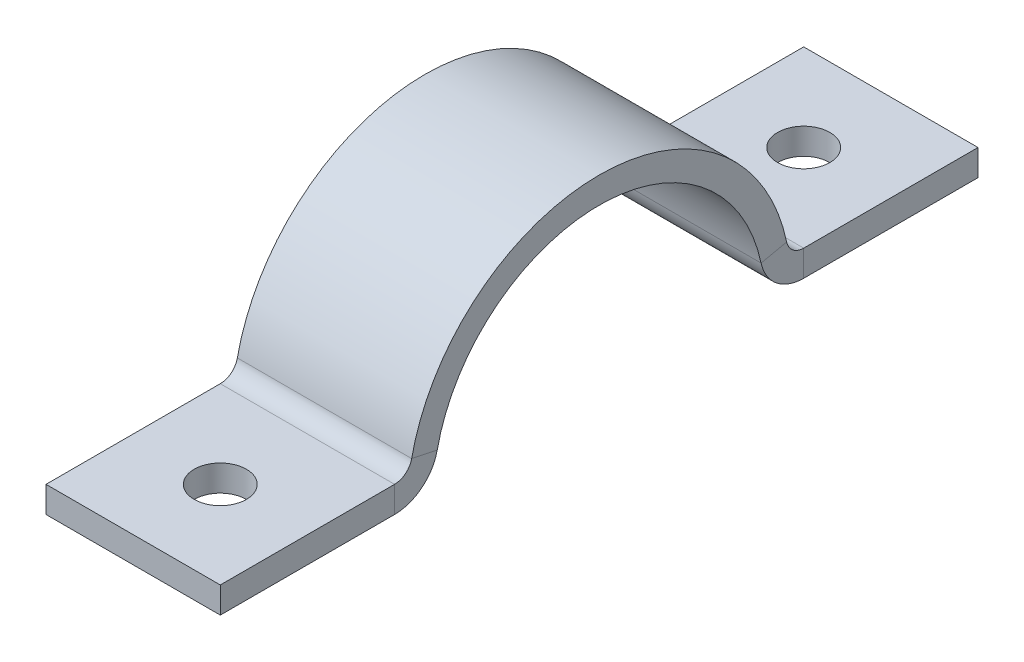
ISO-10303-21;
HEADER;
FILE_DESCRIPTION(('STEP AP214'),'2;1');
FILE_NAME('part.step','',(''),(''),'','','');
FILE_SCHEMA(('AUTOMOTIVE_DESIGN { 1 0 10303 214 1 1 1 1 }'));
ENDSEC;
DATA;
#1=APPLICATION_CONTEXT('core data for automotive mechanical design processes');
#2=APPLICATION_PROTOCOL_DEFINITION('international standard','automotive_design',2000,#1);
#3=PRODUCT_CONTEXT('',#1,'mechanical');
#4=PRODUCT('Part','Part','',(#3));
#5=PRODUCT_RELATED_PRODUCT_CATEGORY('part','',(#4));
#6=PRODUCT_DEFINITION_FORMATION('','',#4);
#7=PRODUCT_DEFINITION_CONTEXT('part definition',#1,'design');
#8=PRODUCT_DEFINITION('design','',#6,#7);
#9=PRODUCT_DEFINITION_SHAPE('','',#8);
#10=(LENGTH_UNIT() NAMED_UNIT(*) SI_UNIT(.MILLI.,.METRE.));
#11=(NAMED_UNIT(*) PLANE_ANGLE_UNIT() SI_UNIT($,.RADIAN.));
#12=(NAMED_UNIT(*) SI_UNIT($,.STERADIAN.) SOLID_ANGLE_UNIT());
#13=UNCERTAINTY_MEASURE_WITH_UNIT(LENGTH_MEASURE(1.E-05),#10,'distance_accuracy_value','');
#14=(GEOMETRIC_REPRESENTATION_CONTEXT(3) GLOBAL_UNCERTAINTY_ASSIGNED_CONTEXT((#13)) GLOBAL_UNIT_ASSIGNED_CONTEXT((#10,
#11,#12)) REPRESENTATION_CONTEXT('',''));
#15=CARTESIAN_POINT('',(0.,0.,0.));
#16=DIRECTION('',(0.,0.,1.));
#17=DIRECTION('',(1.,0.,0.));
#18=AXIS2_PLACEMENT_3D('',#15,#16,#17);
#19=CARTESIAN_POINT('',(0.,0.,-43.473389188611));
#20=DIRECTION('',(0.,0.,-1.));
#21=DIRECTION('',(-1.,0.,0.));
#22=AXIS2_PLACEMENT_3D('',#19,#20,#21);
#23=PLANE('',#22);
#24=DIRECTION('',(0.,1.,0.));
#25=VECTOR('',#24,1.);
#26=CARTESIAN_POINT('',(10.,3.,-43.473389188611));
#27=LINE('',#26,#25);
#28=CARTESIAN_POINT('',(10.,0.,-43.473389188611));
#29=VERTEX_POINT('',#28);
#30=CARTESIAN_POINT('',(10.,3.,-43.473389188611));
#31=VERTEX_POINT('',#30);
#32=EDGE_CURVE('E166',#29,#31,#27,.T.);
#33=ORIENTED_EDGE('',*,*,#32,.F.);
#34=DIRECTION('',(1.,0.,0.));
#35=VECTOR('',#34,1.);
#36=CARTESIAN_POINT('',(10.,0.,-43.473389188611));
#37=LINE('',#36,#35);
#38=CARTESIAN_POINT('',(-10.,0.,-43.473389188611));
#39=VERTEX_POINT('',#38);
#40=EDGE_CURVE('E152',#39,#29,#37,.T.);
#41=ORIENTED_EDGE('',*,*,#40,.F.);
#42=DIRECTION('',(0.,-1.,0.));
#43=VECTOR('',#42,1.);
#44=CARTESIAN_POINT('',(-10.,3.,-43.473389188611));
#45=LINE('',#44,#43);
#46=CARTESIAN_POINT('',(-10.,3.,-43.473389188611));
#47=VERTEX_POINT('',#46);
#48=EDGE_CURVE('E147',#47,#39,#45,.T.);
#49=ORIENTED_EDGE('',*,*,#48,.F.);
#50=DIRECTION('',(-1.,0.,0.));
#51=VECTOR('',#50,1.);
#52=CARTESIAN_POINT('',(10.,3.,-43.473389188611));
#53=LINE('',#52,#51);
#54=EDGE_CURVE('E149',#31,#47,#53,.T.);
#55=ORIENTED_EDGE('',*,*,#54,.F.);
#56=EDGE_LOOP('',(#33,#41,#49,#55));
#57=FACE_BOUND('',#56,.T.);
#58=ADVANCED_FACE('F37',(#57),#23,.T.);
#59=CARTESIAN_POINT('',(0.,0.,43.473389188611));
#60=DIRECTION('',(0.,0.,-1.));
#61=DIRECTION('',(-1.,0.,0.));
#62=AXIS2_PLACEMENT_3D('',#59,#60,#61);
#63=PLANE('',#62);
#64=DIRECTION('',(0.,1.,0.));
#65=VECTOR('',#64,1.);
#66=CARTESIAN_POINT('',(10.,3.,43.473389188611));
#67=LINE('',#66,#65);
#68=CARTESIAN_POINT('',(10.,0.,43.473389188611));
#69=VERTEX_POINT('',#68);
#70=CARTESIAN_POINT('',(10.,3.,43.473389188611));
#71=VERTEX_POINT('',#70);
#72=EDGE_CURVE('E52',#69,#71,#67,.T.);
#73=ORIENTED_EDGE('',*,*,#72,.T.);
#74=DIRECTION('',(-1.,0.,0.));
#75=VECTOR('',#74,1.);
#76=CARTESIAN_POINT('',(10.,3.,43.473389188611));
#77=LINE('',#76,#75);
#78=CARTESIAN_POINT('',(-10.,3.,43.473389188611));
#79=VERTEX_POINT('',#78);
#80=EDGE_CURVE('E11',#71,#79,#77,.T.);
#81=ORIENTED_EDGE('',*,*,#80,.T.);
#82=DIRECTION('',(0.,-1.,0.));
#83=VECTOR('',#82,1.);
#84=CARTESIAN_POINT('',(-10.,3.,43.473389188611));
#85=LINE('',#84,#83);
#86=CARTESIAN_POINT('',(-10.,0.,43.473389188611));
#87=VERTEX_POINT('',#86);
#88=EDGE_CURVE('E208',#79,#87,#85,.T.);
#89=ORIENTED_EDGE('',*,*,#88,.T.);
#90=DIRECTION('',(1.,0.,0.));
#91=VECTOR('',#90,1.);
#92=CARTESIAN_POINT('',(10.,0.,43.473389188611));
#93=LINE('',#92,#91);
#94=EDGE_CURVE('E58',#87,#69,#93,.T.);
#95=ORIENTED_EDGE('',*,*,#94,.T.);
#96=EDGE_LOOP('',(#73,#81,#89,#95));
#97=FACE_BOUND('',#96,.T.);
#98=ADVANCED_FACE('F325',(#97),#63,.F.);
#99=CARTESIAN_POINT('',(-10.,3.,-43.473389188611));
#100=DIRECTION('',(-1.,0.,0.));
#101=DIRECTION('',(0.,0.,1.));
#102=AXIS2_PLACEMENT_3D('',#99,#100,#101);
#103=PLANE('',#102);
#104=DIRECTION('',(0.,0.,1.));
#105=VECTOR('',#104,1.);
#106=CARTESIAN_POINT('',(-10.,0.,-43.473389188611));
#107=LINE('',#106,#105);
#108=CARTESIAN_POINT('',(-10.,0.,-23.473389188611));
#109=VERTEX_POINT('',#108);
#110=EDGE_CURVE('E173',#39,#109,#107,.T.);
#111=ORIENTED_EDGE('',*,*,#110,.T.);
#112=DIRECTION('',(0.,-1.,0.));
#113=VECTOR('',#112,1.);
#114=CARTESIAN_POINT('',(-10.,3.,-23.473389188611));
#115=LINE('',#114,#113);
#116=CARTESIAN_POINT('',(-10.,3.,-23.473389188611));
#117=VERTEX_POINT('',#116);
#118=EDGE_CURVE('E171',#117,#109,#115,.T.);
#119=ORIENTED_EDGE('',*,*,#118,.F.);
#120=DIRECTION('',(0.,0.,1.));
#121=VECTOR('',#120,1.);
#122=CARTESIAN_POINT('',(-10.,3.,-43.473389188611));
#123=LINE('',#122,#121);
#124=EDGE_CURVE('E163',#47,#117,#123,.T.);
#125=ORIENTED_EDGE('',*,*,#124,.F.);
#126=ORIENTED_EDGE('',*,*,#48,.T.);
#127=EDGE_LOOP('',(#111,#119,#125,#126));
#128=FACE_BOUND('',#127,.T.);
#129=ADVANCED_FACE('F169',(#128),#103,.T.);
#130=CARTESIAN_POINT('',(10.,0.,-43.473389188611));
#131=DIRECTION('',(0.,-1.,0.));
#132=DIRECTION('',(0.,0.,-1.));
#133=AXIS2_PLACEMENT_3D('',#130,#131,#132);
#134=PLANE('',#133);
#135=CARTESIAN_POINT('',(0.,0.,-33.473389188611));
#136=DIRECTION('',(0.,-1.,0.));
#137=DIRECTION('',(0.,0.,-1.));
#138=AXIS2_PLACEMENT_3D('',#135,#136,#137);
#139=CIRCLE('',#138,3.);
#140=CARTESIAN_POINT('',(0.,0.,-36.473389188611));
#141=VERTEX_POINT('',#140);
#142=EDGE_CURVE('E266',#141,#141,#139,.T.);
#143=ORIENTED_EDGE('',*,*,#142,.F.);
#144=EDGE_LOOP('',(#143));
#145=FACE_BOUND('',#144,.T.);
#146=DIRECTION('',(0.,0.,1.));
#147=VECTOR('',#146,1.);
#148=CARTESIAN_POINT('',(10.,0.,-43.473389188611));
#149=LINE('',#148,#147);
#150=CARTESIAN_POINT('',(10.,0.,-23.473389188611));
#151=VERTEX_POINT('',#150);
#152=EDGE_CURVE('E219',#29,#151,#149,.T.);
#153=ORIENTED_EDGE('',*,*,#152,.T.);
#154=DIRECTION('',(1.,0.,0.));
#155=VECTOR('',#154,1.);
#156=CARTESIAN_POINT('',(10.,0.,-23.473389188611));
#157=LINE('',#156,#155);
#158=EDGE_CURVE('E216',#109,#151,#157,.T.);
#159=ORIENTED_EDGE('',*,*,#158,.F.);
#160=ORIENTED_EDGE('',*,*,#110,.F.);
#161=ORIENTED_EDGE('',*,*,#40,.T.);
#162=EDGE_LOOP('',(#153,#159,#160,#161));
#163=FACE_BOUND('',#162,.T.);
#164=ADVANCED_FACE('F331',(#145,#163),#134,.T.);
#165=CARTESIAN_POINT('',(10.,3.,-43.473389188611));
#166=DIRECTION('',(1.,0.,0.));
#167=DIRECTION('',(0.,0.,-1.));
#168=AXIS2_PLACEMENT_3D('',#165,#166,#167);
#169=PLANE('',#168);
#170=DIRECTION('',(0.,0.,1.));
#171=VECTOR('',#170,1.);
#172=CARTESIAN_POINT('',(10.,3.,-43.473389188611));
#173=LINE('',#172,#171);
#174=CARTESIAN_POINT('',(10.,3.,-23.473389188611));
#175=VERTEX_POINT('',#174);
#176=EDGE_CURVE('E165',#31,#175,#173,.T.);
#177=ORIENTED_EDGE('',*,*,#176,.T.);
#178=DIRECTION('',(0.,1.,0.));
#179=VECTOR('',#178,1.);
#180=CARTESIAN_POINT('',(10.,3.,-23.473389188611));
#181=LINE('',#180,#179);
#182=EDGE_CURVE('E222',#151,#175,#181,.T.);
#183=ORIENTED_EDGE('',*,*,#182,.F.);
#184=ORIENTED_EDGE('',*,*,#152,.F.);
#185=ORIENTED_EDGE('',*,*,#32,.T.);
#186=EDGE_LOOP('',(#177,#183,#184,#185));
#187=FACE_BOUND('',#186,.T.);
#188=ADVANCED_FACE('F311',(#187),#169,.T.);
#189=CARTESIAN_POINT('',(10.,3.,-43.473389188611));
#190=DIRECTION('',(0.,1.,0.));
#191=DIRECTION('',(0.,0.,1.));
#192=AXIS2_PLACEMENT_3D('',#189,#190,#191);
#193=PLANE('',#192);
#194=CARTESIAN_POINT('',(0.,3.,-33.473389188611));
#195=DIRECTION('',(0.,1.,0.));
#196=DIRECTION('',(0.,0.,1.));
#197=AXIS2_PLACEMENT_3D('',#194,#195,#196);
#198=CIRCLE('',#197,3.);
#199=CARTESIAN_POINT('',(0.,3.,-30.473389188611));
#200=VERTEX_POINT('',#199);
#201=EDGE_CURVE('E40',#200,#200,#198,.T.);
#202=ORIENTED_EDGE('',*,*,#201,.F.);
#203=EDGE_LOOP('',(#202));
#204=FACE_BOUND('',#203,.T.);
#205=DIRECTION('',(-1.,0.,0.));
#206=VECTOR('',#205,1.);
#207=CARTESIAN_POINT('',(10.,3.,-23.473389188611));
#208=LINE('',#207,#206);
#209=EDGE_CURVE('E187',#175,#117,#208,.T.);
#210=ORIENTED_EDGE('',*,*,#209,.F.);
#211=ORIENTED_EDGE('',*,*,#176,.F.);
#212=ORIENTED_EDGE('',*,*,#54,.T.);
#213=ORIENTED_EDGE('',*,*,#124,.T.);
#214=EDGE_LOOP('',(#210,#211,#212,#213));
#215=FACE_BOUND('',#214,.T.);
#216=ADVANCED_FACE('F162',(#204,#215),#193,.T.);
#217=CARTESIAN_POINT('',(-10.,3.,-23.473389188611));
#218=DIRECTION('',(-1.,0.,0.));
#219=DIRECTION('',(0.,0.,1.));
#220=AXIS2_PLACEMENT_3D('',#217,#218,#219);
#221=PLANE('',#220);
#222=CARTESIAN_POINT('',(-10.,5.,-23.473389188611));
#223=DIRECTION('',(-1.,0.,0.));
#224=DIRECTION('',(0.,-1.,0.));
#225=AXIS2_PLACEMENT_3D('',#222,#223,#224);
#226=CIRCLE('',#225,5.00000000000001);
#227=CARTESIAN_POINT('',(-10.,3.95833333333334,-18.583099774317));
#228=VERTEX_POINT('',#227);
#229=EDGE_CURVE('E180',#109,#228,#226,.T.);
#230=ORIENTED_EDGE('',*,*,#229,.T.);
#231=DIRECTION('',(0.,-0.208333333333333,0.978057882858792));
#232=VECTOR('',#231,1.);
#233=CARTESIAN_POINT('',(-10.,4.58333333333333,-21.5172734228934));
#234=LINE('',#233,#232);
#235=CARTESIAN_POINT('',(-10.,4.58333333333333,-21.5172734228934));
#236=VERTEX_POINT('',#235);
#237=EDGE_CURVE('E177',#236,#228,#234,.T.);
#238=ORIENTED_EDGE('',*,*,#237,.F.);
#239=CARTESIAN_POINT('',(-10.,5.,-23.473389188611));
#240=DIRECTION('',(-1.,0.,0.));
#241=DIRECTION('',(0.,-1.,0.));
#242=AXIS2_PLACEMENT_3D('',#239,#240,#241);
#243=CIRCLE('',#242,2.00000000000001);
#244=EDGE_CURVE('E181',#117,#236,#243,.T.);
#245=ORIENTED_EDGE('',*,*,#244,.F.);
#246=ORIENTED_EDGE('',*,*,#118,.T.);
#247=EDGE_LOOP('',(#230,#238,#245,#246));
#248=FACE_BOUND('',#247,.T.);
#249=ADVANCED_FACE('F310',(#248),#221,.T.);
#250=CARTESIAN_POINT('',(0.,5.,-23.473389188611));
#251=DIRECTION('',(-1.,0.,0.));
#252=DIRECTION('',(0.,0.,1.));
#253=AXIS2_PLACEMENT_3D('',#250,#251,#252);
#254=CYLINDRICAL_SURFACE('',#253,5.00000000000001);
#255=CARTESIAN_POINT('',(10.,5.,-23.473389188611));
#256=DIRECTION('',(-1.,0.,0.));
#257=DIRECTION('',(0.,-1.,0.));
#258=AXIS2_PLACEMENT_3D('',#255,#256,#257);
#259=CIRCLE('',#258,5.00000000000001);
#260=CARTESIAN_POINT('',(10.,3.95833333333334,-18.583099774317));
#261=VERTEX_POINT('',#260);
#262=EDGE_CURVE('E225',#151,#261,#259,.T.);
#263=ORIENTED_EDGE('',*,*,#262,.T.);
#264=DIRECTION('',(1.,0.,0.));
#265=VECTOR('',#264,1.);
#266=CARTESIAN_POINT('',(10.,3.95833333333333,-18.583099774317));
#267=LINE('',#266,#265);
#268=EDGE_CURVE('E184',#228,#261,#267,.T.);
#269=ORIENTED_EDGE('',*,*,#268,.F.);
#270=ORIENTED_EDGE('',*,*,#229,.F.);
#271=ORIENTED_EDGE('',*,*,#158,.T.);
#272=EDGE_LOOP('',(#263,#269,#270,#271));
#273=FACE_BOUND('',#272,.T.);
#274=ADVANCED_FACE('F346',(#273),#254,.T.);
#275=CARTESIAN_POINT('',(10.,3.,-23.473389188611));
#276=DIRECTION('',(1.,0.,0.));
#277=DIRECTION('',(0.,0.,-1.));
#278=AXIS2_PLACEMENT_3D('',#275,#276,#277);
#279=PLANE('',#278);
#280=CARTESIAN_POINT('',(10.,5.,-23.473389188611));
#281=DIRECTION('',(-1.,0.,0.));
#282=DIRECTION('',(0.,-1.,0.));
#283=AXIS2_PLACEMENT_3D('',#280,#281,#282);
#284=CIRCLE('',#283,2.00000000000001);
#285=CARTESIAN_POINT('',(10.,4.58333333333333,-21.5172734228934));
#286=VERTEX_POINT('',#285);
#287=EDGE_CURVE('E245',#175,#286,#284,.T.);
#288=ORIENTED_EDGE('',*,*,#287,.T.);
#289=DIRECTION('',(0.,0.208333333333333,-0.978057882858792));
#290=VECTOR('',#289,1.);
#291=CARTESIAN_POINT('',(10.,4.58333333333333,-21.5172734228934));
#292=LINE('',#291,#290);
#293=EDGE_CURVE('E228',#261,#286,#292,.T.);
#294=ORIENTED_EDGE('',*,*,#293,.F.);
#295=ORIENTED_EDGE('',*,*,#262,.F.);
#296=ORIENTED_EDGE('',*,*,#182,.T.);
#297=EDGE_LOOP('',(#288,#294,#295,#296));
#298=FACE_BOUND('',#297,.T.);
#299=ADVANCED_FACE('F317',(#298),#279,.T.);
#300=CARTESIAN_POINT('',(0.,5.,-23.473389188611));
#301=DIRECTION('',(-1.,0.,0.));
#302=DIRECTION('',(0.,0.,1.));
#303=AXIS2_PLACEMENT_3D('',#300,#301,#302);
#304=CYLINDRICAL_SURFACE('',#303,2.00000000000001);
#305=DIRECTION('',(-1.,0.,0.));
#306=VECTOR('',#305,1.);
#307=CARTESIAN_POINT('',(10.,4.58333333333333,-21.5172734228934));
#308=LINE('',#307,#306);
#309=EDGE_CURVE('E198',#286,#236,#308,.T.);
#310=ORIENTED_EDGE('',*,*,#309,.F.);
#311=ORIENTED_EDGE('',*,*,#287,.F.);
#312=ORIENTED_EDGE('',*,*,#209,.T.);
#313=ORIENTED_EDGE('',*,*,#244,.T.);
#314=EDGE_LOOP('',(#310,#311,#312,#313));
#315=FACE_BOUND('',#314,.T.);
#316=ADVANCED_FACE('F313',(#315),#304,.F.);
#317=CARTESIAN_POINT('',(-10.,4.58333333333333,-21.5172734228934));
#318=DIRECTION('',(-1.,0.,0.));
#319=DIRECTION('',(0.,0.,1.));
#320=AXIS2_PLACEMENT_3D('',#317,#318,#319);
#321=PLANE('',#320);
#322=CARTESIAN_POINT('',(-10.,0.,0.));
#323=DIRECTION('',(1.,0.,0.));
#324=DIRECTION('',(0.,0.208333333333333,-0.978057882858792));
#325=AXIS2_PLACEMENT_3D('',#322,#323,#324);
#326=CIRCLE('',#325,19.);
#327=CARTESIAN_POINT('',(-10.,3.95833333333333,18.583099774317));
#328=VERTEX_POINT('',#327);
#329=EDGE_CURVE('E191',#228,#328,#326,.T.);
#330=ORIENTED_EDGE('',*,*,#329,.T.);
#331=DIRECTION('',(0.,-0.208333333333333,-0.978057882858792));
#332=VECTOR('',#331,1.);
#333=CARTESIAN_POINT('',(-10.,4.58333333333333,21.5172734228934));
#334=LINE('',#333,#332);
#335=CARTESIAN_POINT('',(-10.,4.58333333333333,21.5172734228934));
#336=VERTEX_POINT('',#335);
#337=EDGE_CURVE('E188',#336,#328,#334,.T.);
#338=ORIENTED_EDGE('',*,*,#337,.F.);
#339=CARTESIAN_POINT('',(-10.,0.,0.));
#340=DIRECTION('',(1.,0.,0.));
#341=DIRECTION('',(0.,0.208333333333333,-0.978057882858792));
#342=AXIS2_PLACEMENT_3D('',#339,#340,#341);
#343=CIRCLE('',#342,22.);
#344=EDGE_CURVE('E192',#236,#336,#343,.T.);
#345=ORIENTED_EDGE('',*,*,#344,.F.);
#346=ORIENTED_EDGE('',*,*,#237,.T.);
#347=EDGE_LOOP('',(#330,#338,#345,#346));
#348=FACE_BOUND('',#347,.T.);
#349=ADVANCED_FACE('F316',(#348),#321,.T.);
#350=CARTESIAN_POINT('',(0.,0.,0.));
#351=DIRECTION('',(1.,0.,0.));
#352=DIRECTION('',(0.,0.,-1.));
#353=AXIS2_PLACEMENT_3D('',#350,#351,#352);
#354=CYLINDRICAL_SURFACE('',#353,19.);
#355=CARTESIAN_POINT('',(10.,0.,0.));
#356=DIRECTION('',(1.,0.,0.));
#357=DIRECTION('',(0.,0.208333333333333,-0.978057882858792));
#358=AXIS2_PLACEMENT_3D('',#355,#356,#357);
#359=CIRCLE('',#358,19.);
#360=CARTESIAN_POINT('',(10.,3.95833333333333,18.583099774317));
#361=VERTEX_POINT('',#360);
#362=EDGE_CURVE('E230',#261,#361,#359,.T.);
#363=ORIENTED_EDGE('',*,*,#362,.T.);
#364=DIRECTION('',(1.,0.,0.));
#365=VECTOR('',#364,1.);
#366=CARTESIAN_POINT('',(10.,3.95833333333333,18.583099774317));
#367=LINE('',#366,#365);
#368=EDGE_CURVE('E195',#328,#361,#367,.T.);
#369=ORIENTED_EDGE('',*,*,#368,.F.);
#370=ORIENTED_EDGE('',*,*,#329,.F.);
#371=ORIENTED_EDGE('',*,*,#268,.T.);
#372=EDGE_LOOP('',(#363,#369,#370,#371));
#373=FACE_BOUND('',#372,.T.);
#374=ADVANCED_FACE('F350',(#373),#354,.F.);
#375=CARTESIAN_POINT('',(10.,4.58333333333333,-21.5172734228934));
#376=DIRECTION('',(1.,0.,0.));
#377=DIRECTION('',(0.,0.,-1.));
#378=AXIS2_PLACEMENT_3D('',#375,#376,#377);
#379=PLANE('',#378);
#380=CARTESIAN_POINT('',(10.,0.,0.));
#381=DIRECTION('',(1.,0.,0.));
#382=DIRECTION('',(0.,0.208333333333333,-0.978057882858792));
#383=AXIS2_PLACEMENT_3D('',#380,#381,#382);
#384=CIRCLE('',#383,22.);
#385=CARTESIAN_POINT('',(10.,4.58333333333333,21.5172734228934));
#386=VERTEX_POINT('',#385);
#387=EDGE_CURVE('E249',#286,#386,#384,.T.);
#388=ORIENTED_EDGE('',*,*,#387,.T.);
#389=DIRECTION('',(0.,0.208333333333333,0.978057882858792));
#390=VECTOR('',#389,1.);
#391=CARTESIAN_POINT('',(10.,4.58333333333333,21.5172734228934));
#392=LINE('',#391,#390);
#393=EDGE_CURVE('E233',#361,#386,#392,.T.);
#394=ORIENTED_EDGE('',*,*,#393,.F.);
#395=ORIENTED_EDGE('',*,*,#362,.F.);
#396=ORIENTED_EDGE('',*,*,#293,.T.);
#397=EDGE_LOOP('',(#388,#394,#395,#396));
#398=FACE_BOUND('',#397,.T.);
#399=ADVANCED_FACE('F322',(#398),#379,.T.);
#400=CARTESIAN_POINT('',(0.,0.,0.));
#401=DIRECTION('',(1.,0.,0.));
#402=DIRECTION('',(0.,0.,-1.));
#403=AXIS2_PLACEMENT_3D('',#400,#401,#402);
#404=CYLINDRICAL_SURFACE('',#403,22.);
#405=DIRECTION('',(-1.,0.,0.));
#406=VECTOR('',#405,1.);
#407=CARTESIAN_POINT('',(10.,4.58333333333333,21.5172734228934));
#408=LINE('',#407,#406);
#409=EDGE_CURVE('E207',#386,#336,#408,.T.);
#410=ORIENTED_EDGE('',*,*,#409,.F.);
#411=ORIENTED_EDGE('',*,*,#387,.F.);
#412=ORIENTED_EDGE('',*,*,#309,.T.);
#413=ORIENTED_EDGE('',*,*,#344,.T.);
#414=EDGE_LOOP('',(#410,#411,#412,#413));
#415=FACE_BOUND('',#414,.T.);
#416=ADVANCED_FACE('F319',(#415),#404,.T.);
#417=CARTESIAN_POINT('',(-10.,4.58333333333333,21.5172734228934));
#418=DIRECTION('',(-1.,0.,0.));
#419=DIRECTION('',(0.,0.,1.));
#420=AXIS2_PLACEMENT_3D('',#417,#418,#419);
#421=PLANE('',#420);
#422=CARTESIAN_POINT('',(-10.,5.,23.473389188611));
#423=DIRECTION('',(-1.,0.,0.));
#424=DIRECTION('',(0.,-0.208333333333333,-0.978057882858792));
#425=AXIS2_PLACEMENT_3D('',#422,#423,#424);
#426=CIRCLE('',#425,5.00000000000001);
#427=CARTESIAN_POINT('',(-10.,0.,23.473389188611));
#428=VERTEX_POINT('',#427);
#429=EDGE_CURVE('E128',#328,#428,#426,.T.);
#430=ORIENTED_EDGE('',*,*,#429,.T.);
#431=DIRECTION('',(0.,-1.,0.));
#432=VECTOR('',#431,1.);
#433=CARTESIAN_POINT('',(-10.,3.,23.473389188611));
#434=LINE('',#433,#432);
#435=CARTESIAN_POINT('',(-10.,3.,23.473389188611));
#436=VERTEX_POINT('',#435);
#437=EDGE_CURVE('E199',#436,#428,#434,.T.);
#438=ORIENTED_EDGE('',*,*,#437,.F.);
#439=CARTESIAN_POINT('',(-10.,5.,23.473389188611));
#440=DIRECTION('',(-1.,0.,0.));
#441=DIRECTION('',(0.,-0.208333333333333,-0.978057882858792));
#442=AXIS2_PLACEMENT_3D('',#439,#440,#441);
#443=CIRCLE('',#442,2.);
#444=EDGE_CURVE('E202',#336,#436,#443,.T.);
#445=ORIENTED_EDGE('',*,*,#444,.F.);
#446=ORIENTED_EDGE('',*,*,#337,.T.);
#447=EDGE_LOOP('',(#430,#438,#445,#446));
#448=FACE_BOUND('',#447,.T.);
#449=ADVANCED_FACE('F289',(#448),#421,.T.);
#450=CARTESIAN_POINT('',(0.,5.,23.473389188611));
#451=DIRECTION('',(-1.,0.,0.));
#452=DIRECTION('',(0.,0.,1.));
#453=AXIS2_PLACEMENT_3D('',#450,#451,#452);
#454=CYLINDRICAL_SURFACE('',#453,5.00000000000001);
#455=CARTESIAN_POINT('',(10.,5.,23.473389188611));
#456=DIRECTION('',(-1.,0.,0.));
#457=DIRECTION('',(0.,-0.208333333333333,-0.978057882858792));
#458=AXIS2_PLACEMENT_3D('',#455,#456,#457);
#459=CIRCLE('',#458,5.00000000000001);
#460=CARTESIAN_POINT('',(10.,0.,23.473389188611));
#461=VERTEX_POINT('',#460);
#462=EDGE_CURVE('E122',#361,#461,#459,.T.);
#463=ORIENTED_EDGE('',*,*,#462,.T.);
#464=DIRECTION('',(1.,0.,0.));
#465=VECTOR('',#464,1.);
#466=CARTESIAN_POINT('',(10.,0.,23.473389188611));
#467=LINE('',#466,#465);
#468=EDGE_CURVE('E204',#428,#461,#467,.T.);
#469=ORIENTED_EDGE('',*,*,#468,.F.);
#470=ORIENTED_EDGE('',*,*,#429,.F.);
#471=ORIENTED_EDGE('',*,*,#368,.T.);
#472=EDGE_LOOP('',(#463,#469,#470,#471));
#473=FACE_BOUND('',#472,.T.);
#474=ADVANCED_FACE('F286',(#473),#454,.T.);
#475=CARTESIAN_POINT('',(10.,4.58333333333333,21.5172734228934));
#476=DIRECTION('',(1.,0.,0.));
#477=DIRECTION('',(0.,0.,-1.));
#478=AXIS2_PLACEMENT_3D('',#475,#476,#477);
#479=PLANE('',#478);
#480=CARTESIAN_POINT('',(10.,5.,23.473389188611));
#481=DIRECTION('',(-1.,0.,0.));
#482=DIRECTION('',(0.,-0.208333333333333,-0.978057882858792));
#483=AXIS2_PLACEMENT_3D('',#480,#481,#482);
#484=CIRCLE('',#483,2.);
#485=CARTESIAN_POINT('',(10.,3.,23.473389188611));
#486=VERTEX_POINT('',#485);
#487=EDGE_CURVE('E253',#386,#486,#484,.T.);
#488=ORIENTED_EDGE('',*,*,#487,.T.);
#489=DIRECTION('',(0.,1.,0.));
#490=VECTOR('',#489,1.);
#491=CARTESIAN_POINT('',(10.,3.,23.473389188611));
#492=LINE('',#491,#490);
#493=EDGE_CURVE('E236',#461,#486,#492,.T.);
#494=ORIENTED_EDGE('',*,*,#493,.F.);
#495=ORIENTED_EDGE('',*,*,#462,.F.);
#496=ORIENTED_EDGE('',*,*,#393,.T.);
#497=EDGE_LOOP('',(#488,#494,#495,#496));
#498=FACE_BOUND('',#497,.T.);
#499=ADVANCED_FACE('F297',(#498),#479,.T.);
#500=CARTESIAN_POINT('',(0.,5.,23.473389188611));
#501=DIRECTION('',(-1.,0.,0.));
#502=DIRECTION('',(0.,0.,1.));
#503=AXIS2_PLACEMENT_3D('',#500,#501,#502);
#504=CYLINDRICAL_SURFACE('',#503,2.);
#505=DIRECTION('',(-1.,0.,0.));
#506=VECTOR('',#505,1.);
#507=CARTESIAN_POINT('',(10.,3.,23.473389188611));
#508=LINE('',#507,#506);
#509=EDGE_CURVE('E214',#486,#436,#508,.T.);
#510=ORIENTED_EDGE('',*,*,#509,.F.);
#511=ORIENTED_EDGE('',*,*,#487,.F.);
#512=ORIENTED_EDGE('',*,*,#409,.T.);
#513=ORIENTED_EDGE('',*,*,#444,.T.);
#514=EDGE_LOOP('',(#510,#511,#512,#513));
#515=FACE_BOUND('',#514,.T.);
#516=ADVANCED_FACE('F295',(#515),#504,.F.);
#517=CARTESIAN_POINT('',(-10.,3.,23.473389188611));
#518=DIRECTION('',(-1.,0.,0.));
#519=DIRECTION('',(0.,0.,1.));
#520=AXIS2_PLACEMENT_3D('',#517,#518,#519);
#521=PLANE('',#520);
#522=DIRECTION('',(0.,0.,1.));
#523=VECTOR('',#522,1.);
#524=CARTESIAN_POINT('',(-10.,0.,23.473389188611));
#525=LINE('',#524,#523);
#526=EDGE_CURVE('E103',#428,#87,#525,.T.);
#527=ORIENTED_EDGE('',*,*,#526,.T.);
#528=ORIENTED_EDGE('',*,*,#88,.F.);
#529=DIRECTION('',(0.,0.,1.));
#530=VECTOR('',#529,1.);
#531=CARTESIAN_POINT('',(-10.,3.,23.473389188611));
#532=LINE('',#531,#530);
#533=EDGE_CURVE('E210',#436,#79,#532,.T.);
#534=ORIENTED_EDGE('',*,*,#533,.F.);
#535=ORIENTED_EDGE('',*,*,#437,.T.);
#536=EDGE_LOOP('',(#527,#528,#534,#535));
#537=FACE_BOUND('',#536,.T.);
#538=ADVANCED_FACE('F284',(#537),#521,.T.);
#539=CARTESIAN_POINT('',(10.,0.,23.473389188611));
#540=DIRECTION('',(0.,-1.,0.));
#541=DIRECTION('',(0.,0.,-1.));
#542=AXIS2_PLACEMENT_3D('',#539,#540,#541);
#543=PLANE('',#542);
#544=CARTESIAN_POINT('',(0.,0.,33.473389188611));
#545=DIRECTION('',(0.,-1.,0.));
#546=DIRECTION('',(0.,0.,-1.));
#547=AXIS2_PLACEMENT_3D('',#544,#545,#546);
#548=CIRCLE('',#547,3.);
#549=CARTESIAN_POINT('',(0.,0.,30.473389188611));
#550=VERTEX_POINT('',#549);
#551=EDGE_CURVE('E271',#550,#550,#548,.T.);
#552=ORIENTED_EDGE('',*,*,#551,.F.);
#553=EDGE_LOOP('',(#552));
#554=FACE_BOUND('',#553,.T.);
#555=DIRECTION('',(0.,0.,1.));
#556=VECTOR('',#555,1.);
#557=CARTESIAN_POINT('',(10.,0.,23.473389188611));
#558=LINE('',#557,#556);
#559=EDGE_CURVE('E96',#461,#69,#558,.T.);
#560=ORIENTED_EDGE('',*,*,#559,.T.);
#561=ORIENTED_EDGE('',*,*,#94,.F.);
#562=ORIENTED_EDGE('',*,*,#526,.F.);
#563=ORIENTED_EDGE('',*,*,#468,.T.);
#564=EDGE_LOOP('',(#560,#561,#562,#563));
#565=FACE_BOUND('',#564,.T.);
#566=ADVANCED_FACE('F281',(#554,#565),#543,.T.);
#567=CARTESIAN_POINT('',(10.,3.,23.473389188611));
#568=DIRECTION('',(1.,0.,0.));
#569=DIRECTION('',(0.,0.,-1.));
#570=AXIS2_PLACEMENT_3D('',#567,#568,#569);
#571=PLANE('',#570);
#572=DIRECTION('',(0.,0.,1.));
#573=VECTOR('',#572,1.);
#574=CARTESIAN_POINT('',(10.,3.,23.473389188611));
#575=LINE('',#574,#573);
#576=EDGE_CURVE('E45',#486,#71,#575,.T.);
#577=ORIENTED_EDGE('',*,*,#576,.T.);
#578=ORIENTED_EDGE('',*,*,#72,.F.);
#579=ORIENTED_EDGE('',*,*,#559,.F.);
#580=ORIENTED_EDGE('',*,*,#493,.T.);
#581=EDGE_LOOP('',(#577,#578,#579,#580));
#582=FACE_BOUND('',#581,.T.);
#583=ADVANCED_FACE('F283',(#582),#571,.T.);
#584=CARTESIAN_POINT('',(10.,3.,23.473389188611));
#585=DIRECTION('',(0.,1.,0.));
#586=DIRECTION('',(0.,0.,1.));
#587=AXIS2_PLACEMENT_3D('',#584,#585,#586);
#588=PLANE('',#587);
#589=CARTESIAN_POINT('',(0.,3.,33.473389188611));
#590=DIRECTION('',(0.,1.,0.));
#591=DIRECTION('',(0.,0.,1.));
#592=AXIS2_PLACEMENT_3D('',#589,#590,#591);
#593=CIRCLE('',#592,3.);
#594=CARTESIAN_POINT('',(0.,3.,36.473389188611));
#595=VERTEX_POINT('',#594);
#596=EDGE_CURVE('E264',#595,#595,#593,.T.);
#597=ORIENTED_EDGE('',*,*,#596,.F.);
#598=EDGE_LOOP('',(#597));
#599=FACE_BOUND('',#598,.T.);
#600=ORIENTED_EDGE('',*,*,#80,.F.);
#601=ORIENTED_EDGE('',*,*,#576,.F.);
#602=ORIENTED_EDGE('',*,*,#509,.T.);
#603=ORIENTED_EDGE('',*,*,#533,.T.);
#604=EDGE_LOOP('',(#600,#601,#602,#603));
#605=FACE_BOUND('',#604,.T.);
#606=ADVANCED_FACE('F293',(#599,#605),#588,.T.);
#607=CARTESIAN_POINT('',(0.,22.,33.473389188611));
#608=DIRECTION('',(0.,-1.,0.));
#609=DIRECTION('',(0.,0.,-1.));
#610=AXIS2_PLACEMENT_3D('',#607,#608,#609);
#611=CYLINDRICAL_SURFACE('',#610,3.);
#612=ORIENTED_EDGE('',*,*,#596,.T.);
#613=EDGE_LOOP('',(#612));
#614=FACE_BOUND('',#613,.T.);
#615=ORIENTED_EDGE('',*,*,#551,.T.);
#616=EDGE_LOOP('',(#615));
#617=FACE_BOUND('',#616,.T.);
#618=ADVANCED_FACE('F279',(#614,#617),#611,.F.);
#619=CARTESIAN_POINT('',(0.,22.,-33.473389188611));
#620=DIRECTION('',(0.,-1.,0.));
#621=DIRECTION('',(0.,0.,-1.));
#622=AXIS2_PLACEMENT_3D('',#619,#620,#621);
#623=CYLINDRICAL_SURFACE('',#622,3.);
#624=ORIENTED_EDGE('',*,*,#201,.T.);
#625=EDGE_LOOP('',(#624));
#626=FACE_BOUND('',#625,.T.);
#627=ORIENTED_EDGE('',*,*,#142,.T.);
#628=EDGE_LOOP('',(#627));
#629=FACE_BOUND('',#628,.T.);
#630=ADVANCED_FACE('F336',(#626,#629),#623,.F.);
#631=CLOSED_SHELL('',(#58,#98,#129,#164,#188,#216,#249,#274,#299,#316,#349,#374,#399,#416,#449,
#474,#499,#516,#538,#566,#583,#606,#618,#630));
#632=MANIFOLD_SOLID_BREP('B2',#631);
#633=ADVANCED_BREP_SHAPE_REPRESENTATION('',(#18,#632),#14);
#634=SHAPE_DEFINITION_REPRESENTATION(#9,#633);
ENDSEC;
END-ISO-10303-21;
